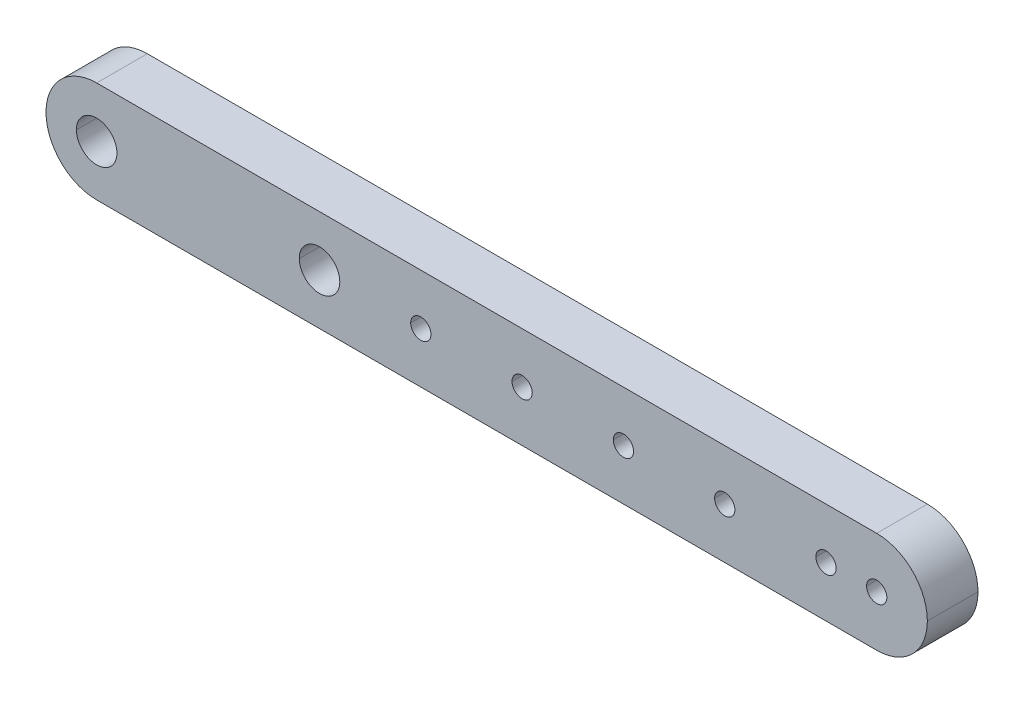
ISO-10303-21;
HEADER;
FILE_DESCRIPTION(('STEP AP214'),'2;1');
FILE_NAME('part.step','',(''),(''),'','','');
FILE_SCHEMA(('AUTOMOTIVE_DESIGN { 1 0 10303 214 1 1 1 1 }'));
ENDSEC;
DATA;
#1=APPLICATION_CONTEXT('core data for automotive mechanical design processes');
#2=APPLICATION_PROTOCOL_DEFINITION('international standard','automotive_design',2000,#1);
#3=PRODUCT_CONTEXT('',#1,'mechanical');
#4=PRODUCT('Part','Part','',(#3));
#5=PRODUCT_RELATED_PRODUCT_CATEGORY('part','',(#4));
#6=PRODUCT_DEFINITION_FORMATION('','',#4);
#7=PRODUCT_DEFINITION_CONTEXT('part definition',#1,'design');
#8=PRODUCT_DEFINITION('design','',#6,#7);
#9=PRODUCT_DEFINITION_SHAPE('','',#8);
#10=(LENGTH_UNIT() NAMED_UNIT(*) SI_UNIT(.MILLI.,.METRE.));
#11=(NAMED_UNIT(*) PLANE_ANGLE_UNIT() SI_UNIT($,.RADIAN.));
#12=(NAMED_UNIT(*) SI_UNIT($,.STERADIAN.) SOLID_ANGLE_UNIT());
#13=UNCERTAINTY_MEASURE_WITH_UNIT(LENGTH_MEASURE(1.E-05),#10,'distance_accuracy_value','');
#14=(GEOMETRIC_REPRESENTATION_CONTEXT(3) GLOBAL_UNCERTAINTY_ASSIGNED_CONTEXT((#13)) GLOBAL_UNIT_ASSIGNED_CONTEXT((#10,
#11,#12)) REPRESENTATION_CONTEXT('',''));
#15=CARTESIAN_POINT('',(0.,0.,0.));
#16=DIRECTION('',(0.,0.,1.));
#17=DIRECTION('',(1.,0.,0.));
#18=AXIS2_PLACEMENT_3D('',#15,#16,#17);
#19=CARTESIAN_POINT('',(164.,10.,10.));
#20=DIRECTION('',(0.,0.,-1.));
#21=DIRECTION('',(-1.,0.,0.));
#22=AXIS2_PLACEMENT_3D('',#19,#20,#21);
#23=CYLINDRICAL_SURFACE('',#22,10.);
#24=CARTESIAN_POINT('',(164.,10.,10.));
#25=DIRECTION('',(0.,0.,1.));
#26=DIRECTION('',(-1.,0.,0.));
#27=AXIS2_PLACEMENT_3D('',#24,#25,#26);
#28=CIRCLE('',#27,10.);
#29=CARTESIAN_POINT('',(164.,0.,10.));
#30=VERTEX_POINT('',#29);
#31=CARTESIAN_POINT('',(174.,10.,10.));
#32=VERTEX_POINT('',#31);
#33=EDGE_CURVE('E254',#30,#32,#28,.T.);
#34=ORIENTED_EDGE('',*,*,#33,.F.);
#35=DIRECTION('',(0.,0.,1.));
#36=VECTOR('',#35,1.);
#37=CARTESIAN_POINT('',(164.,0.,10.));
#38=LINE('',#37,#36);
#39=CARTESIAN_POINT('',(164.,0.,0.));
#40=VERTEX_POINT('',#39);
#41=EDGE_CURVE('E189',#40,#30,#38,.T.);
#42=ORIENTED_EDGE('',*,*,#41,.F.);
#43=CARTESIAN_POINT('',(164.,10.,0.));
#44=DIRECTION('',(0.,0.,-1.));
#45=DIRECTION('',(-1.,0.,0.));
#46=AXIS2_PLACEMENT_3D('',#43,#44,#45);
#47=CIRCLE('',#46,10.);
#48=CARTESIAN_POINT('',(174.,10.,0.));
#49=VERTEX_POINT('',#48);
#50=EDGE_CURVE('E276',#49,#40,#47,.T.);
#51=ORIENTED_EDGE('',*,*,#50,.F.);
#52=DIRECTION('',(0.,0.,1.));
#53=VECTOR('',#52,1.);
#54=CARTESIAN_POINT('',(174.,10.,10.));
#55=LINE('',#54,#53);
#56=EDGE_CURVE('E11',#49,#32,#55,.T.);
#57=ORIENTED_EDGE('',*,*,#56,.T.);
#58=EDGE_LOOP('',(#34,#42,#51,#57));
#59=FACE_BOUND('',#58,.T.);
#60=ADVANCED_FACE('F17',(#59),#23,.T.);
#61=CARTESIAN_POINT('',(164.,10.,10.));
#62=DIRECTION('',(0.,0.,-1.));
#63=DIRECTION('',(-1.,0.,0.));
#64=AXIS2_PLACEMENT_3D('',#61,#62,#63);
#65=CYLINDRICAL_SURFACE('',#64,10.);
#66=DIRECTION('',(0.,0.,-1.));
#67=VECTOR('',#66,1.);
#68=CARTESIAN_POINT('',(164.,20.,10.));
#69=LINE('',#68,#67);
#70=CARTESIAN_POINT('',(164.,20.,10.));
#71=VERTEX_POINT('',#70);
#72=CARTESIAN_POINT('',(164.,20.,0.));
#73=VERTEX_POINT('',#72);
#74=EDGE_CURVE('E188',#71,#73,#69,.T.);
#75=ORIENTED_EDGE('',*,*,#74,.F.);
#76=CARTESIAN_POINT('',(164.,10.,10.));
#77=DIRECTION('',(0.,0.,1.));
#78=DIRECTION('',(-1.,0.,0.));
#79=AXIS2_PLACEMENT_3D('',#76,#77,#78);
#80=CIRCLE('',#79,10.);
#81=EDGE_CURVE('E258',#32,#71,#80,.T.);
#82=ORIENTED_EDGE('',*,*,#81,.F.);
#83=ORIENTED_EDGE('',*,*,#56,.F.);
#84=CARTESIAN_POINT('',(164.,10.,0.));
#85=DIRECTION('',(0.,0.,-1.));
#86=DIRECTION('',(-1.,0.,0.));
#87=AXIS2_PLACEMENT_3D('',#84,#85,#86);
#88=CIRCLE('',#87,10.);
#89=EDGE_CURVE('E196',#73,#49,#88,.T.);
#90=ORIENTED_EDGE('',*,*,#89,.F.);
#91=EDGE_LOOP('',(#75,#82,#83,#90));
#92=FACE_BOUND('',#91,.T.);
#93=ADVANCED_FACE('F19',(#92),#65,.T.);
#94=CARTESIAN_POINT('',(10.,10.,10.));
#95=DIRECTION('',(0.,0.,-1.));
#96=DIRECTION('',(-1.,0.,0.));
#97=AXIS2_PLACEMENT_3D('',#94,#95,#96);
#98=CYLINDRICAL_SURFACE('',#97,10.);
#99=CARTESIAN_POINT('',(10.,10.,10.));
#100=DIRECTION('',(0.,0.,1.));
#101=DIRECTION('',(-1.,0.,0.));
#102=AXIS2_PLACEMENT_3D('',#99,#100,#101);
#103=CIRCLE('',#102,10.);
#104=CARTESIAN_POINT('',(0.,10.,10.));
#105=VERTEX_POINT('',#104);
#106=CARTESIAN_POINT('',(10.,0.,10.));
#107=VERTEX_POINT('',#106);
#108=EDGE_CURVE('E262',#105,#107,#103,.T.);
#109=ORIENTED_EDGE('',*,*,#108,.F.);
#110=DIRECTION('',(0.,0.,-1.));
#111=VECTOR('',#110,1.);
#112=CARTESIAN_POINT('',(0.,10.,10.));
#113=LINE('',#112,#111);
#114=CARTESIAN_POINT('',(0.,10.,0.));
#115=VERTEX_POINT('',#114);
#116=EDGE_CURVE('E27',#105,#115,#113,.T.);
#117=ORIENTED_EDGE('',*,*,#116,.T.);
#118=CARTESIAN_POINT('',(10.,10.,0.));
#119=DIRECTION('',(0.,0.,-1.));
#120=DIRECTION('',(-1.,0.,0.));
#121=AXIS2_PLACEMENT_3D('',#118,#119,#120);
#122=CIRCLE('',#121,10.);
#123=CARTESIAN_POINT('',(10.,0.,0.));
#124=VERTEX_POINT('',#123);
#125=EDGE_CURVE('E201',#124,#115,#122,.T.);
#126=ORIENTED_EDGE('',*,*,#125,.F.);
#127=DIRECTION('',(0.,0.,-1.));
#128=VECTOR('',#127,1.);
#129=CARTESIAN_POINT('',(10.,0.,10.));
#130=LINE('',#129,#128);
#131=EDGE_CURVE('E237',#107,#124,#130,.T.);
#132=ORIENTED_EDGE('',*,*,#131,.F.);
#133=EDGE_LOOP('',(#109,#117,#126,#132));
#134=FACE_BOUND('',#133,.T.);
#135=ADVANCED_FACE('F690',(#134),#98,.T.);
#136=CARTESIAN_POINT('',(10.,10.,10.));
#137=DIRECTION('',(0.,0.,-1.));
#138=DIRECTION('',(-1.,0.,0.));
#139=AXIS2_PLACEMENT_3D('',#136,#137,#138);
#140=CYLINDRICAL_SURFACE('',#139,10.);
#141=ORIENTED_EDGE('',*,*,#116,.F.);
#142=CARTESIAN_POINT('',(10.,10.,10.));
#143=DIRECTION('',(0.,0.,1.));
#144=DIRECTION('',(-1.,0.,0.));
#145=AXIS2_PLACEMENT_3D('',#142,#143,#144);
#146=CIRCLE('',#145,10.);
#147=CARTESIAN_POINT('',(10.,20.,10.));
#148=VERTEX_POINT('',#147);
#149=EDGE_CURVE('E183',#148,#105,#146,.T.);
#150=ORIENTED_EDGE('',*,*,#149,.F.);
#151=DIRECTION('',(0.,0.,1.));
#152=VECTOR('',#151,1.);
#153=CARTESIAN_POINT('',(10.,20.,10.));
#154=LINE('',#153,#152);
#155=CARTESIAN_POINT('',(10.,20.,0.));
#156=VERTEX_POINT('',#155);
#157=EDGE_CURVE('E176',#156,#148,#154,.T.);
#158=ORIENTED_EDGE('',*,*,#157,.F.);
#159=CARTESIAN_POINT('',(10.,10.,0.));
#160=DIRECTION('',(0.,0.,-1.));
#161=DIRECTION('',(-1.,0.,0.));
#162=AXIS2_PLACEMENT_3D('',#159,#160,#161);
#163=CIRCLE('',#162,10.);
#164=EDGE_CURVE('E180',#115,#156,#163,.T.);
#165=ORIENTED_EDGE('',*,*,#164,.F.);
#166=EDGE_LOOP('',(#141,#150,#158,#165));
#167=FACE_BOUND('',#166,.T.);
#168=ADVANCED_FACE('F178',(#167),#140,.T.);
#169=CARTESIAN_POINT('',(134.,10.,10.));
#170=DIRECTION('',(0.,0.,-1.));
#171=DIRECTION('',(-1.,0.,0.));
#172=AXIS2_PLACEMENT_3D('',#169,#170,#171);
#173=CYLINDRICAL_SURFACE('',#172,2.);
#174=DIRECTION('',(0.,0.,-1.));
#175=VECTOR('',#174,1.);
#176=CARTESIAN_POINT('',(136.,10.,10.));
#177=LINE('',#176,#175);
#178=CARTESIAN_POINT('',(136.,10.,10.));
#179=VERTEX_POINT('',#178);
#180=CARTESIAN_POINT('',(136.,10.,0.));
#181=VERTEX_POINT('',#180);
#182=EDGE_CURVE('E622',#179,#181,#177,.T.);
#183=ORIENTED_EDGE('',*,*,#182,.F.);
#184=CARTESIAN_POINT('',(134.,10.,10.));
#185=DIRECTION('',(0.,0.,1.));
#186=DIRECTION('',(1.,0.,0.));
#187=AXIS2_PLACEMENT_3D('',#184,#185,#186);
#188=CIRCLE('',#187,2.);
#189=CARTESIAN_POINT('',(132.,10.,10.));
#190=VERTEX_POINT('',#189);
#191=EDGE_CURVE('E300',#179,#190,#188,.T.);
#192=ORIENTED_EDGE('',*,*,#191,.T.);
#193=DIRECTION('',(0.,0.,-1.));
#194=VECTOR('',#193,1.);
#195=CARTESIAN_POINT('',(132.,10.,10.));
#196=LINE('',#195,#194);
#197=CARTESIAN_POINT('',(132.,10.,0.));
#198=VERTEX_POINT('',#197);
#199=EDGE_CURVE('E607',#190,#198,#196,.T.);
#200=ORIENTED_EDGE('',*,*,#199,.T.);
#201=CARTESIAN_POINT('',(134.,10.,0.));
#202=DIRECTION('',(0.,0.,1.));
#203=DIRECTION('',(1.,0.,0.));
#204=AXIS2_PLACEMENT_3D('',#201,#202,#203);
#205=CIRCLE('',#204,2.);
#206=EDGE_CURVE('E233',#181,#198,#205,.T.);
#207=ORIENTED_EDGE('',*,*,#206,.F.);
#208=EDGE_LOOP('',(#183,#192,#200,#207));
#209=FACE_BOUND('',#208,.T.);
#210=ADVANCED_FACE('F754',(#209),#173,.F.);
#211=CARTESIAN_POINT('',(94.,10.,10.));
#212=DIRECTION('',(0.,0.,-1.));
#213=DIRECTION('',(-1.,0.,0.));
#214=AXIS2_PLACEMENT_3D('',#211,#212,#213);
#215=CYLINDRICAL_SURFACE('',#214,2.);
#216=DIRECTION('',(0.,0.,-1.));
#217=VECTOR('',#216,1.);
#218=CARTESIAN_POINT('',(96.,10.,10.));
#219=LINE('',#218,#217);
#220=CARTESIAN_POINT('',(96.,10.,10.));
#221=VERTEX_POINT('',#220);
#222=CARTESIAN_POINT('',(96.,10.,0.));
#223=VERTEX_POINT('',#222);
#224=EDGE_CURVE('E592',#221,#223,#219,.T.);
#225=ORIENTED_EDGE('',*,*,#224,.F.);
#226=CARTESIAN_POINT('',(94.,10.,10.));
#227=DIRECTION('',(0.,0.,1.));
#228=DIRECTION('',(1.,0.,0.));
#229=AXIS2_PLACEMENT_3D('',#226,#227,#228);
#230=CIRCLE('',#229,2.);
#231=CARTESIAN_POINT('',(92.,10.,10.));
#232=VERTEX_POINT('',#231);
#233=EDGE_CURVE('E299',#221,#232,#230,.T.);
#234=ORIENTED_EDGE('',*,*,#233,.T.);
#235=DIRECTION('',(0.,0.,-1.));
#236=VECTOR('',#235,1.);
#237=CARTESIAN_POINT('',(92.,10.,10.));
#238=LINE('',#237,#236);
#239=CARTESIAN_POINT('',(92.,10.,0.));
#240=VERTEX_POINT('',#239);
#241=EDGE_CURVE('E578',#232,#240,#238,.T.);
#242=ORIENTED_EDGE('',*,*,#241,.T.);
#243=CARTESIAN_POINT('',(94.,10.,0.));
#244=DIRECTION('',(0.,0.,1.));
#245=DIRECTION('',(1.,0.,0.));
#246=AXIS2_PLACEMENT_3D('',#243,#244,#245);
#247=CIRCLE('',#246,2.);
#248=EDGE_CURVE('E220',#223,#240,#247,.T.);
#249=ORIENTED_EDGE('',*,*,#248,.F.);
#250=EDGE_LOOP('',(#225,#234,#242,#249));
#251=FACE_BOUND('',#250,.T.);
#252=ADVANCED_FACE('F750',(#251),#215,.F.);
#253=CARTESIAN_POINT('',(114.,10.,10.));
#254=DIRECTION('',(0.,0.,-1.));
#255=DIRECTION('',(-1.,0.,0.));
#256=AXIS2_PLACEMENT_3D('',#253,#254,#255);
#257=CYLINDRICAL_SURFACE('',#256,2.);
#258=DIRECTION('',(0.,0.,-1.));
#259=VECTOR('',#258,1.);
#260=CARTESIAN_POINT('',(116.,10.,10.));
#261=LINE('',#260,#259);
#262=CARTESIAN_POINT('',(116.,10.,10.));
#263=VERTEX_POINT('',#262);
#264=CARTESIAN_POINT('',(116.,10.,0.));
#265=VERTEX_POINT('',#264);
#266=EDGE_CURVE('E561',#263,#265,#261,.T.);
#267=ORIENTED_EDGE('',*,*,#266,.F.);
#268=CARTESIAN_POINT('',(114.,10.,10.));
#269=DIRECTION('',(0.,0.,1.));
#270=DIRECTION('',(1.,0.,0.));
#271=AXIS2_PLACEMENT_3D('',#268,#269,#270);
#272=CIRCLE('',#271,2.);
#273=CARTESIAN_POINT('',(112.,10.,10.));
#274=VERTEX_POINT('',#273);
#275=EDGE_CURVE('E295',#263,#274,#272,.T.);
#276=ORIENTED_EDGE('',*,*,#275,.T.);
#277=DIRECTION('',(0.,0.,-1.));
#278=VECTOR('',#277,1.);
#279=CARTESIAN_POINT('',(112.,10.,10.));
#280=LINE('',#279,#278);
#281=CARTESIAN_POINT('',(112.,10.,0.));
#282=VERTEX_POINT('',#281);
#283=EDGE_CURVE('E543',#274,#282,#280,.T.);
#284=ORIENTED_EDGE('',*,*,#283,.T.);
#285=CARTESIAN_POINT('',(114.,10.,0.));
#286=DIRECTION('',(0.,0.,1.));
#287=DIRECTION('',(1.,0.,0.));
#288=AXIS2_PLACEMENT_3D('',#285,#286,#287);
#289=CIRCLE('',#288,2.);
#290=EDGE_CURVE('E229',#265,#282,#289,.T.);
#291=ORIENTED_EDGE('',*,*,#290,.F.);
#292=EDGE_LOOP('',(#267,#276,#284,#291));
#293=FACE_BOUND('',#292,.T.);
#294=ADVANCED_FACE('F753',(#293),#257,.F.);
#295=CARTESIAN_POINT('',(74.,10.,10.));
#296=DIRECTION('',(0.,0.,-1.));
#297=DIRECTION('',(-1.,0.,0.));
#298=AXIS2_PLACEMENT_3D('',#295,#296,#297);
#299=CYLINDRICAL_SURFACE('',#298,2.);
#300=DIRECTION('',(0.,0.,-1.));
#301=VECTOR('',#300,1.);
#302=CARTESIAN_POINT('',(76.,10.,10.));
#303=LINE('',#302,#301);
#304=CARTESIAN_POINT('',(76.,10.,10.));
#305=VERTEX_POINT('',#304);
#306=CARTESIAN_POINT('',(76.,10.,0.));
#307=VERTEX_POINT('',#306);
#308=EDGE_CURVE('E526',#305,#307,#303,.T.);
#309=ORIENTED_EDGE('',*,*,#308,.F.);
#310=CARTESIAN_POINT('',(74.,10.,10.));
#311=DIRECTION('',(0.,0.,1.));
#312=DIRECTION('',(1.,0.,0.));
#313=AXIS2_PLACEMENT_3D('',#310,#311,#312);
#314=CIRCLE('',#313,2.);
#315=CARTESIAN_POINT('',(72.,10.,10.));
#316=VERTEX_POINT('',#315);
#317=EDGE_CURVE('E292',#305,#316,#314,.T.);
#318=ORIENTED_EDGE('',*,*,#317,.T.);
#319=DIRECTION('',(0.,0.,-1.));
#320=VECTOR('',#319,1.);
#321=CARTESIAN_POINT('',(72.,10.,10.));
#322=LINE('',#321,#320);
#323=CARTESIAN_POINT('',(72.,10.,0.));
#324=VERTEX_POINT('',#323);
#325=EDGE_CURVE('E508',#316,#324,#322,.T.);
#326=ORIENTED_EDGE('',*,*,#325,.T.);
#327=CARTESIAN_POINT('',(74.,10.,0.));
#328=DIRECTION('',(0.,0.,1.));
#329=DIRECTION('',(1.,0.,0.));
#330=AXIS2_PLACEMENT_3D('',#327,#328,#329);
#331=CIRCLE('',#330,2.);
#332=EDGE_CURVE('E217',#307,#324,#331,.T.);
#333=ORIENTED_EDGE('',*,*,#332,.F.);
#334=EDGE_LOOP('',(#309,#318,#326,#333));
#335=FACE_BOUND('',#334,.T.);
#336=ADVANCED_FACE('F706',(#335),#299,.F.);
#337=CARTESIAN_POINT('',(164.,10.,10.));
#338=DIRECTION('',(0.,0.,-1.));
#339=DIRECTION('',(-1.,0.,0.));
#340=AXIS2_PLACEMENT_3D('',#337,#338,#339);
#341=CYLINDRICAL_SURFACE('',#340,1.99999999999997);
#342=DIRECTION('',(0.,0.,-1.));
#343=VECTOR('',#342,1.);
#344=CARTESIAN_POINT('',(166.,10.,10.));
#345=LINE('',#344,#343);
#346=CARTESIAN_POINT('',(166.,10.,10.));
#347=VERTEX_POINT('',#346);
#348=CARTESIAN_POINT('',(166.,10.,0.));
#349=VERTEX_POINT('',#348);
#350=EDGE_CURVE('E491',#347,#349,#345,.T.);
#351=ORIENTED_EDGE('',*,*,#350,.F.);
#352=CARTESIAN_POINT('',(164.,10.,10.));
#353=DIRECTION('',(0.,0.,1.));
#354=DIRECTION('',(1.,0.,0.));
#355=AXIS2_PLACEMENT_3D('',#352,#353,#354);
#356=CIRCLE('',#355,1.99999999999997);
#357=CARTESIAN_POINT('',(162.,10.,10.));
#358=VERTEX_POINT('',#357);
#359=EDGE_CURVE('E289',#347,#358,#356,.T.);
#360=ORIENTED_EDGE('',*,*,#359,.T.);
#361=DIRECTION('',(0.,0.,-1.));
#362=VECTOR('',#361,1.);
#363=CARTESIAN_POINT('',(162.,10.,10.));
#364=LINE('',#363,#362);
#365=CARTESIAN_POINT('',(162.,10.,0.));
#366=VERTEX_POINT('',#365);
#367=EDGE_CURVE('E473',#358,#366,#364,.T.);
#368=ORIENTED_EDGE('',*,*,#367,.T.);
#369=CARTESIAN_POINT('',(164.,10.,0.));
#370=DIRECTION('',(0.,0.,1.));
#371=DIRECTION('',(1.,0.,0.));
#372=AXIS2_PLACEMENT_3D('',#369,#370,#371);
#373=CIRCLE('',#372,1.99999999999997);
#374=EDGE_CURVE('E225',#349,#366,#373,.T.);
#375=ORIENTED_EDGE('',*,*,#374,.F.);
#376=EDGE_LOOP('',(#351,#360,#368,#375));
#377=FACE_BOUND('',#376,.T.);
#378=ADVANCED_FACE('F702',(#377),#341,.F.);
#379=CARTESIAN_POINT('',(154.,10.,10.));
#380=DIRECTION('',(0.,0.,-1.));
#381=DIRECTION('',(-1.,0.,0.));
#382=AXIS2_PLACEMENT_3D('',#379,#380,#381);
#383=CYLINDRICAL_SURFACE('',#382,2.);
#384=DIRECTION('',(0.,0.,-1.));
#385=VECTOR('',#384,1.);
#386=CARTESIAN_POINT('',(156.,10.,10.));
#387=LINE('',#386,#385);
#388=CARTESIAN_POINT('',(156.,10.,10.));
#389=VERTEX_POINT('',#388);
#390=CARTESIAN_POINT('',(156.,10.,0.));
#391=VERTEX_POINT('',#390);
#392=EDGE_CURVE('E457',#389,#391,#387,.T.);
#393=ORIENTED_EDGE('',*,*,#392,.F.);
#394=CARTESIAN_POINT('',(154.,10.,10.));
#395=DIRECTION('',(0.,0.,1.));
#396=DIRECTION('',(1.,0.,0.));
#397=AXIS2_PLACEMENT_3D('',#394,#395,#396);
#398=CIRCLE('',#397,2.);
#399=CARTESIAN_POINT('',(152.,10.,10.));
#400=VERTEX_POINT('',#399);
#401=EDGE_CURVE('E283',#389,#400,#398,.T.);
#402=ORIENTED_EDGE('',*,*,#401,.T.);
#403=DIRECTION('',(0.,0.,-1.));
#404=VECTOR('',#403,1.);
#405=CARTESIAN_POINT('',(152.,10.,10.));
#406=LINE('',#405,#404);
#407=CARTESIAN_POINT('',(152.,10.,0.));
#408=VERTEX_POINT('',#407);
#409=EDGE_CURVE('E433',#400,#408,#406,.T.);
#410=ORIENTED_EDGE('',*,*,#409,.T.);
#411=CARTESIAN_POINT('',(154.,10.,0.));
#412=DIRECTION('',(0.,0.,1.));
#413=DIRECTION('',(1.,0.,0.));
#414=AXIS2_PLACEMENT_3D('',#411,#412,#413);
#415=CIRCLE('',#414,2.);
#416=EDGE_CURVE('E216',#391,#408,#415,.T.);
#417=ORIENTED_EDGE('',*,*,#416,.F.);
#418=EDGE_LOOP('',(#393,#402,#410,#417));
#419=FACE_BOUND('',#418,.T.);
#420=ADVANCED_FACE('F705',(#419),#383,.F.);
#421=CARTESIAN_POINT('',(10.,10.,10.));
#422=DIRECTION('',(0.,0.,-1.));
#423=DIRECTION('',(-1.,0.,0.));
#424=AXIS2_PLACEMENT_3D('',#421,#422,#423);
#425=CYLINDRICAL_SURFACE('',#424,4.);
#426=DIRECTION('',(0.,0.,-1.));
#427=VECTOR('',#426,1.);
#428=CARTESIAN_POINT('',(14.,10.,10.));
#429=LINE('',#428,#427);
#430=CARTESIAN_POINT('',(14.,10.,10.));
#431=VERTEX_POINT('',#430);
#432=CARTESIAN_POINT('',(14.,10.,0.));
#433=VERTEX_POINT('',#432);
#434=EDGE_CURVE('E422',#431,#433,#429,.T.);
#435=ORIENTED_EDGE('',*,*,#434,.F.);
#436=CARTESIAN_POINT('',(10.,10.,10.));
#437=DIRECTION('',(0.,0.,1.));
#438=DIRECTION('',(1.,0.,0.));
#439=AXIS2_PLACEMENT_3D('',#436,#437,#438);
#440=CIRCLE('',#439,4.);
#441=CARTESIAN_POINT('',(6.,10.,10.));
#442=VERTEX_POINT('',#441);
#443=EDGE_CURVE('E280',#431,#442,#440,.T.);
#444=ORIENTED_EDGE('',*,*,#443,.T.);
#445=DIRECTION('',(0.,0.,-1.));
#446=VECTOR('',#445,1.);
#447=CARTESIAN_POINT('',(6.,10.,10.));
#448=LINE('',#447,#446);
#449=CARTESIAN_POINT('',(6.,10.,0.));
#450=VERTEX_POINT('',#449);
#451=EDGE_CURVE('E394',#442,#450,#448,.T.);
#452=ORIENTED_EDGE('',*,*,#451,.T.);
#453=CARTESIAN_POINT('',(10.,10.,0.));
#454=DIRECTION('',(0.,0.,1.));
#455=DIRECTION('',(1.,0.,0.));
#456=AXIS2_PLACEMENT_3D('',#453,#454,#455);
#457=CIRCLE('',#456,4.);
#458=EDGE_CURVE('E215',#433,#450,#457,.T.);
#459=ORIENTED_EDGE('',*,*,#458,.F.);
#460=EDGE_LOOP('',(#435,#444,#452,#459));
#461=FACE_BOUND('',#460,.T.);
#462=ADVANCED_FACE('F716',(#461),#425,.F.);
#463=CARTESIAN_POINT('',(54.,10.,10.));
#464=DIRECTION('',(0.,0.,-1.));
#465=DIRECTION('',(-1.,0.,0.));
#466=AXIS2_PLACEMENT_3D('',#463,#464,#465);
#467=CYLINDRICAL_SURFACE('',#466,4.);
#468=DIRECTION('',(0.,0.,-1.));
#469=VECTOR('',#468,1.);
#470=CARTESIAN_POINT('',(58.,10.,10.));
#471=LINE('',#470,#469);
#472=CARTESIAN_POINT('',(58.,10.,10.));
#473=VERTEX_POINT('',#472);
#474=CARTESIAN_POINT('',(58.,10.,0.));
#475=VERTEX_POINT('',#474);
#476=EDGE_CURVE('E393',#473,#475,#471,.T.);
#477=ORIENTED_EDGE('',*,*,#476,.F.);
#478=CARTESIAN_POINT('',(54.,10.,10.));
#479=DIRECTION('',(0.,0.,1.));
#480=DIRECTION('',(1.,0.,0.));
#481=AXIS2_PLACEMENT_3D('',#478,#479,#480);
#482=CIRCLE('',#481,4.);
#483=CARTESIAN_POINT('',(50.,10.,10.));
#484=VERTEX_POINT('',#483);
#485=EDGE_CURVE('E277',#473,#484,#482,.T.);
#486=ORIENTED_EDGE('',*,*,#485,.T.);
#487=DIRECTION('',(0.,0.,-1.));
#488=VECTOR('',#487,1.);
#489=CARTESIAN_POINT('',(50.,10.,10.));
#490=LINE('',#489,#488);
#491=CARTESIAN_POINT('',(50.,10.,0.));
#492=VERTEX_POINT('',#491);
#493=EDGE_CURVE('E383',#484,#492,#490,.T.);
#494=ORIENTED_EDGE('',*,*,#493,.T.);
#495=CARTESIAN_POINT('',(54.,10.,0.));
#496=DIRECTION('',(0.,0.,1.));
#497=DIRECTION('',(1.,0.,0.));
#498=AXIS2_PLACEMENT_3D('',#495,#496,#497);
#499=CIRCLE('',#498,4.);
#500=EDGE_CURVE('E212',#475,#492,#499,.T.);
#501=ORIENTED_EDGE('',*,*,#500,.F.);
#502=EDGE_LOOP('',(#477,#486,#494,#501));
#503=FACE_BOUND('',#502,.T.);
#504=ADVANCED_FACE('F713',(#503),#467,.F.);
#505=CARTESIAN_POINT('',(60.,20.,10.));
#506=DIRECTION('',(0.,-1.,0.));
#507=DIRECTION('',(0.,0.,-1.));
#508=AXIS2_PLACEMENT_3D('',#505,#506,#507);
#509=PLANE('',#508);
#510=DIRECTION('',(-1.,0.,0.));
#511=VECTOR('',#510,1.);
#512=CARTESIAN_POINT('',(60.,20.,0.));
#513=LINE('',#512,#511);
#514=EDGE_CURVE('E191',#73,#156,#513,.T.);
#515=ORIENTED_EDGE('',*,*,#514,.T.);
#516=ORIENTED_EDGE('',*,*,#157,.T.);
#517=DIRECTION('',(-1.,0.,0.));
#518=VECTOR('',#517,1.);
#519=CARTESIAN_POINT('',(0.,20.,10.));
#520=LINE('',#519,#518);
#521=EDGE_CURVE('E273',#71,#148,#520,.T.);
#522=ORIENTED_EDGE('',*,*,#521,.F.);
#523=ORIENTED_EDGE('',*,*,#74,.T.);
#524=EDGE_LOOP('',(#515,#516,#522,#523));
#525=FACE_BOUND('',#524,.T.);
#526=ADVANCED_FACE('F192',(#525),#509,.F.);
#527=CARTESIAN_POINT('',(174.,0.,10.));
#528=DIRECTION('',(0.,1.,0.));
#529=DIRECTION('',(1.,0.,0.));
#530=AXIS2_PLACEMENT_3D('',#527,#528,#529);
#531=PLANE('',#530);
#532=DIRECTION('',(1.,0.,0.));
#533=VECTOR('',#532,1.);
#534=CARTESIAN_POINT('',(0.,0.,10.));
#535=LINE('',#534,#533);
#536=EDGE_CURVE('E249',#107,#30,#535,.T.);
#537=ORIENTED_EDGE('',*,*,#536,.F.);
#538=ORIENTED_EDGE('',*,*,#131,.T.);
#539=DIRECTION('',(1.,0.,0.));
#540=VECTOR('',#539,1.);
#541=CARTESIAN_POINT('',(174.,0.,0.));
#542=LINE('',#541,#540);
#543=EDGE_CURVE('E208',#124,#40,#542,.T.);
#544=ORIENTED_EDGE('',*,*,#543,.T.);
#545=ORIENTED_EDGE('',*,*,#41,.T.);
#546=EDGE_LOOP('',(#537,#538,#544,#545));
#547=FACE_BOUND('',#546,.T.);
#548=ADVANCED_FACE('F247',(#547),#531,.F.);
#549=CARTESIAN_POINT('',(0.,0.,0.));
#550=DIRECTION('',(0.,0.,-1.));
#551=DIRECTION('',(0.,-1.,0.));
#552=AXIS2_PLACEMENT_3D('',#549,#550,#551);
#553=PLANE('',#552);
#554=CARTESIAN_POINT('',(134.,10.,0.));
#555=DIRECTION('',(0.,0.,1.));
#556=DIRECTION('',(1.,0.,0.));
#557=AXIS2_PLACEMENT_3D('',#554,#555,#556);
#558=CIRCLE('',#557,2.);
#559=EDGE_CURVE('E615',#198,#181,#558,.T.);
#560=ORIENTED_EDGE('',*,*,#559,.T.);
#561=ORIENTED_EDGE('',*,*,#206,.T.);
#562=EDGE_LOOP('',(#560,#561));
#563=FACE_BOUND('',#562,.T.);
#564=CARTESIAN_POINT('',(114.,10.,0.));
#565=DIRECTION('',(0.,0.,1.));
#566=DIRECTION('',(1.,0.,0.));
#567=AXIS2_PLACEMENT_3D('',#564,#565,#566);
#568=CIRCLE('',#567,2.);
#569=EDGE_CURVE('E553',#282,#265,#568,.T.);
#570=ORIENTED_EDGE('',*,*,#569,.T.);
#571=ORIENTED_EDGE('',*,*,#290,.T.);
#572=EDGE_LOOP('',(#570,#571));
#573=FACE_BOUND('',#572,.T.);
#574=CARTESIAN_POINT('',(164.,10.,0.));
#575=DIRECTION('',(0.,0.,1.));
#576=DIRECTION('',(1.,0.,0.));
#577=AXIS2_PLACEMENT_3D('',#574,#575,#576);
#578=CIRCLE('',#577,1.99999999999997);
#579=EDGE_CURVE('E482',#366,#349,#578,.T.);
#580=ORIENTED_EDGE('',*,*,#579,.T.);
#581=ORIENTED_EDGE('',*,*,#374,.T.);
#582=EDGE_LOOP('',(#580,#581));
#583=FACE_BOUND('',#582,.T.);
#584=CARTESIAN_POINT('',(10.,10.,0.));
#585=DIRECTION('',(0.,0.,1.));
#586=DIRECTION('',(1.,0.,0.));
#587=AXIS2_PLACEMENT_3D('',#584,#585,#586);
#588=CIRCLE('',#587,4.);
#589=EDGE_CURVE('E404',#450,#433,#588,.T.);
#590=ORIENTED_EDGE('',*,*,#589,.T.);
#591=ORIENTED_EDGE('',*,*,#458,.T.);
#592=EDGE_LOOP('',(#590,#591));
#593=FACE_BOUND('',#592,.T.);
#594=CARTESIAN_POINT('',(54.,10.,0.));
#595=DIRECTION('',(0.,0.,1.));
#596=DIRECTION('',(1.,0.,0.));
#597=AXIS2_PLACEMENT_3D('',#594,#595,#596);
#598=CIRCLE('',#597,4.);
#599=EDGE_CURVE('E413',#492,#475,#598,.T.);
#600=ORIENTED_EDGE('',*,*,#599,.T.);
#601=ORIENTED_EDGE('',*,*,#500,.T.);
#602=EDGE_LOOP('',(#600,#601));
#603=FACE_BOUND('',#602,.T.);
#604=CARTESIAN_POINT('',(154.,10.,0.));
#605=DIRECTION('',(0.,0.,1.));
#606=DIRECTION('',(1.,0.,0.));
#607=AXIS2_PLACEMENT_3D('',#604,#605,#606);
#608=CIRCLE('',#607,2.);
#609=EDGE_CURVE('E449',#408,#391,#608,.T.);
#610=ORIENTED_EDGE('',*,*,#609,.T.);
#611=ORIENTED_EDGE('',*,*,#416,.T.);
#612=EDGE_LOOP('',(#610,#611));
#613=FACE_BOUND('',#612,.T.);
#614=CARTESIAN_POINT('',(74.,10.,0.));
#615=DIRECTION('',(0.,0.,1.));
#616=DIRECTION('',(1.,0.,0.));
#617=AXIS2_PLACEMENT_3D('',#614,#615,#616);
#618=CIRCLE('',#617,2.);
#619=EDGE_CURVE('E517',#324,#307,#618,.T.);
#620=ORIENTED_EDGE('',*,*,#619,.T.);
#621=ORIENTED_EDGE('',*,*,#332,.T.);
#622=EDGE_LOOP('',(#620,#621));
#623=FACE_BOUND('',#622,.T.);
#624=CARTESIAN_POINT('',(94.,10.,0.));
#625=DIRECTION('',(0.,0.,1.));
#626=DIRECTION('',(1.,0.,0.));
#627=AXIS2_PLACEMENT_3D('',#624,#625,#626);
#628=CIRCLE('',#627,2.);
#629=EDGE_CURVE('E585',#240,#223,#628,.T.);
#630=ORIENTED_EDGE('',*,*,#629,.T.);
#631=ORIENTED_EDGE('',*,*,#248,.T.);
#632=EDGE_LOOP('',(#630,#631));
#633=FACE_BOUND('',#632,.T.);
#634=ORIENTED_EDGE('',*,*,#543,.F.);
#635=ORIENTED_EDGE('',*,*,#125,.T.);
#636=ORIENTED_EDGE('',*,*,#164,.T.);
#637=ORIENTED_EDGE('',*,*,#514,.F.);
#638=ORIENTED_EDGE('',*,*,#89,.T.);
#639=ORIENTED_EDGE('',*,*,#50,.T.);
#640=EDGE_LOOP('',(#634,#635,#636,#637,#638,#639));
#641=FACE_BOUND('',#640,.T.);
#642=ADVANCED_FACE('F199',(#563,#573,#583,#593,#603,#613,#623,#633,#641),#553,.T.);
#643=CARTESIAN_POINT('',(0.,0.,10.));
#644=DIRECTION('',(0.,0.,-1.));
#645=DIRECTION('',(0.,-1.,0.));
#646=AXIS2_PLACEMENT_3D('',#643,#644,#645);
#647=PLANE('',#646);
#648=CARTESIAN_POINT('',(134.,10.,10.));
#649=DIRECTION('',(0.,0.,1.));
#650=DIRECTION('',(1.,0.,0.));
#651=AXIS2_PLACEMENT_3D('',#648,#649,#650);
#652=CIRCLE('',#651,2.);
#653=EDGE_CURVE('E629',#190,#179,#652,.T.);
#654=ORIENTED_EDGE('',*,*,#653,.F.);
#655=ORIENTED_EDGE('',*,*,#191,.F.);
#656=EDGE_LOOP('',(#654,#655));
#657=FACE_BOUND('',#656,.T.);
#658=CARTESIAN_POINT('',(94.,10.,10.));
#659=DIRECTION('',(0.,0.,1.));
#660=DIRECTION('',(1.,0.,0.));
#661=AXIS2_PLACEMENT_3D('',#658,#659,#660);
#662=CIRCLE('',#661,2.);
#663=EDGE_CURVE('E600',#232,#221,#662,.T.);
#664=ORIENTED_EDGE('',*,*,#663,.F.);
#665=ORIENTED_EDGE('',*,*,#233,.F.);
#666=EDGE_LOOP('',(#664,#665));
#667=FACE_BOUND('',#666,.T.);
#668=CARTESIAN_POINT('',(114.,10.,10.));
#669=DIRECTION('',(0.,0.,1.));
#670=DIRECTION('',(1.,0.,0.));
#671=AXIS2_PLACEMENT_3D('',#668,#669,#670);
#672=CIRCLE('',#671,2.);
#673=EDGE_CURVE('E570',#274,#263,#672,.T.);
#674=ORIENTED_EDGE('',*,*,#673,.F.);
#675=ORIENTED_EDGE('',*,*,#275,.F.);
#676=EDGE_LOOP('',(#674,#675));
#677=FACE_BOUND('',#676,.T.);
#678=CARTESIAN_POINT('',(74.,10.,10.));
#679=DIRECTION('',(0.,0.,1.));
#680=DIRECTION('',(1.,0.,0.));
#681=AXIS2_PLACEMENT_3D('',#678,#679,#680);
#682=CIRCLE('',#681,2.);
#683=EDGE_CURVE('E534',#316,#305,#682,.T.);
#684=ORIENTED_EDGE('',*,*,#683,.F.);
#685=ORIENTED_EDGE('',*,*,#317,.F.);
#686=EDGE_LOOP('',(#684,#685));
#687=FACE_BOUND('',#686,.T.);
#688=CARTESIAN_POINT('',(164.,10.,10.));
#689=DIRECTION('',(0.,0.,1.));
#690=DIRECTION('',(1.,0.,0.));
#691=AXIS2_PLACEMENT_3D('',#688,#689,#690);
#692=CIRCLE('',#691,1.99999999999997);
#693=EDGE_CURVE('E499',#358,#347,#692,.T.);
#694=ORIENTED_EDGE('',*,*,#693,.F.);
#695=ORIENTED_EDGE('',*,*,#359,.F.);
#696=EDGE_LOOP('',(#694,#695));
#697=FACE_BOUND('',#696,.T.);
#698=CARTESIAN_POINT('',(154.,10.,10.));
#699=DIRECTION('',(0.,0.,1.));
#700=DIRECTION('',(1.,0.,0.));
#701=AXIS2_PLACEMENT_3D('',#698,#699,#700);
#702=CIRCLE('',#701,2.);
#703=EDGE_CURVE('E465',#400,#389,#702,.T.);
#704=ORIENTED_EDGE('',*,*,#703,.F.);
#705=ORIENTED_EDGE('',*,*,#401,.F.);
#706=EDGE_LOOP('',(#704,#705));
#707=FACE_BOUND('',#706,.T.);
#708=CARTESIAN_POINT('',(10.,10.,10.));
#709=DIRECTION('',(0.,0.,1.));
#710=DIRECTION('',(1.,0.,0.));
#711=AXIS2_PLACEMENT_3D('',#708,#709,#710);
#712=CIRCLE('',#711,4.);
#713=EDGE_CURVE('E428',#442,#431,#712,.T.);
#714=ORIENTED_EDGE('',*,*,#713,.F.);
#715=ORIENTED_EDGE('',*,*,#443,.F.);
#716=EDGE_LOOP('',(#714,#715));
#717=FACE_BOUND('',#716,.T.);
#718=CARTESIAN_POINT('',(54.,10.,10.));
#719=DIRECTION('',(0.,0.,1.));
#720=DIRECTION('',(1.,0.,0.));
#721=AXIS2_PLACEMENT_3D('',#718,#719,#720);
#722=CIRCLE('',#721,4.);
#723=EDGE_CURVE('E388',#484,#473,#722,.T.);
#724=ORIENTED_EDGE('',*,*,#723,.F.);
#725=ORIENTED_EDGE('',*,*,#485,.F.);
#726=EDGE_LOOP('',(#724,#725));
#727=FACE_BOUND('',#726,.T.);
#728=ORIENTED_EDGE('',*,*,#149,.T.);
#729=ORIENTED_EDGE('',*,*,#108,.T.);
#730=ORIENTED_EDGE('',*,*,#536,.T.);
#731=ORIENTED_EDGE('',*,*,#33,.T.);
#732=ORIENTED_EDGE('',*,*,#81,.T.);
#733=ORIENTED_EDGE('',*,*,#521,.T.);
#734=EDGE_LOOP('',(#728,#729,#730,#731,#732,#733));
#735=FACE_BOUND('',#734,.T.);
#736=ADVANCED_FACE('F260',(#657,#667,#677,#687,#697,#707,#717,#727,#735),#647,.F.);
#737=CARTESIAN_POINT('',(54.,10.,10.));
#738=DIRECTION('',(0.,0.,-1.));
#739=DIRECTION('',(-1.,0.,0.));
#740=AXIS2_PLACEMENT_3D('',#737,#738,#739);
#741=CYLINDRICAL_SURFACE('',#740,4.);
#742=ORIENTED_EDGE('',*,*,#723,.T.);
#743=ORIENTED_EDGE('',*,*,#476,.T.);
#744=ORIENTED_EDGE('',*,*,#599,.F.);
#745=ORIENTED_EDGE('',*,*,#493,.F.);
#746=EDGE_LOOP('',(#742,#743,#744,#745));
#747=FACE_BOUND('',#746,.T.);
#748=ADVANCED_FACE('F738',(#747),#741,.F.);
#749=CARTESIAN_POINT('',(10.,10.,10.));
#750=DIRECTION('',(0.,0.,-1.));
#751=DIRECTION('',(-1.,0.,0.));
#752=AXIS2_PLACEMENT_3D('',#749,#750,#751);
#753=CYLINDRICAL_SURFACE('',#752,4.);
#754=ORIENTED_EDGE('',*,*,#713,.T.);
#755=ORIENTED_EDGE('',*,*,#434,.T.);
#756=ORIENTED_EDGE('',*,*,#589,.F.);
#757=ORIENTED_EDGE('',*,*,#451,.F.);
#758=EDGE_LOOP('',(#754,#755,#756,#757));
#759=FACE_BOUND('',#758,.T.);
#760=ADVANCED_FACE('F745',(#759),#753,.F.);
#761=CARTESIAN_POINT('',(154.,10.,10.));
#762=DIRECTION('',(0.,0.,-1.));
#763=DIRECTION('',(-1.,0.,0.));
#764=AXIS2_PLACEMENT_3D('',#761,#762,#763);
#765=CYLINDRICAL_SURFACE('',#764,2.);
#766=ORIENTED_EDGE('',*,*,#703,.T.);
#767=ORIENTED_EDGE('',*,*,#392,.T.);
#768=ORIENTED_EDGE('',*,*,#609,.F.);
#769=ORIENTED_EDGE('',*,*,#409,.F.);
#770=EDGE_LOOP('',(#766,#767,#768,#769));
#771=FACE_BOUND('',#770,.T.);
#772=ADVANCED_FACE('F724',(#771),#765,.F.);
#773=CARTESIAN_POINT('',(164.,10.,10.));
#774=DIRECTION('',(0.,0.,-1.));
#775=DIRECTION('',(-1.,0.,0.));
#776=AXIS2_PLACEMENT_3D('',#773,#774,#775);
#777=CYLINDRICAL_SURFACE('',#776,1.99999999999997);
#778=ORIENTED_EDGE('',*,*,#693,.T.);
#779=ORIENTED_EDGE('',*,*,#350,.T.);
#780=ORIENTED_EDGE('',*,*,#579,.F.);
#781=ORIENTED_EDGE('',*,*,#367,.F.);
#782=EDGE_LOOP('',(#778,#779,#780,#781));
#783=FACE_BOUND('',#782,.T.);
#784=ADVANCED_FACE('F720',(#783),#777,.F.);
#785=CARTESIAN_POINT('',(74.,10.,10.));
#786=DIRECTION('',(0.,0.,-1.));
#787=DIRECTION('',(-1.,0.,0.));
#788=AXIS2_PLACEMENT_3D('',#785,#786,#787);
#789=CYLINDRICAL_SURFACE('',#788,2.);
#790=ORIENTED_EDGE('',*,*,#683,.T.);
#791=ORIENTED_EDGE('',*,*,#308,.T.);
#792=ORIENTED_EDGE('',*,*,#619,.F.);
#793=ORIENTED_EDGE('',*,*,#325,.F.);
#794=EDGE_LOOP('',(#790,#791,#792,#793));
#795=FACE_BOUND('',#794,.T.);
#796=ADVANCED_FACE('F723',(#795),#789,.F.);
#797=CARTESIAN_POINT('',(114.,10.,10.));
#798=DIRECTION('',(0.,0.,-1.));
#799=DIRECTION('',(-1.,0.,0.));
#800=AXIS2_PLACEMENT_3D('',#797,#798,#799);
#801=CYLINDRICAL_SURFACE('',#800,2.);
#802=ORIENTED_EDGE('',*,*,#673,.T.);
#803=ORIENTED_EDGE('',*,*,#266,.T.);
#804=ORIENTED_EDGE('',*,*,#569,.F.);
#805=ORIENTED_EDGE('',*,*,#283,.F.);
#806=EDGE_LOOP('',(#802,#803,#804,#805));
#807=FACE_BOUND('',#806,.T.);
#808=ADVANCED_FACE('F728',(#807),#801,.F.);
#809=CARTESIAN_POINT('',(94.,10.,10.));
#810=DIRECTION('',(0.,0.,-1.));
#811=DIRECTION('',(-1.,0.,0.));
#812=AXIS2_PLACEMENT_3D('',#809,#810,#811);
#813=CYLINDRICAL_SURFACE('',#812,2.);
#814=ORIENTED_EDGE('',*,*,#663,.T.);
#815=ORIENTED_EDGE('',*,*,#224,.T.);
#816=ORIENTED_EDGE('',*,*,#629,.F.);
#817=ORIENTED_EDGE('',*,*,#241,.F.);
#818=EDGE_LOOP('',(#814,#815,#816,#817));
#819=FACE_BOUND('',#818,.T.);
#820=ADVANCED_FACE('F711',(#819),#813,.F.);
#821=CARTESIAN_POINT('',(134.,10.,10.));
#822=DIRECTION('',(0.,0.,-1.));
#823=DIRECTION('',(-1.,0.,0.));
#824=AXIS2_PLACEMENT_3D('',#821,#822,#823);
#825=CYLINDRICAL_SURFACE('',#824,2.);
#826=ORIENTED_EDGE('',*,*,#653,.T.);
#827=ORIENTED_EDGE('',*,*,#182,.T.);
#828=ORIENTED_EDGE('',*,*,#559,.F.);
#829=ORIENTED_EDGE('',*,*,#199,.F.);
#830=EDGE_LOOP('',(#826,#827,#828,#829));
#831=FACE_BOUND('',#830,.T.);
#832=ADVANCED_FACE('F708',(#831),#825,.F.);
#833=CLOSED_SHELL('',(#60,#93,#135,#168,#210,#252,#294,#336,#378,#420,#462,#504,#526,#548,#642,
#736,#748,#760,#772,#784,#796,#808,#820,#832));
#834=MANIFOLD_SOLID_BREP('B1',#833);
#835=ADVANCED_BREP_SHAPE_REPRESENTATION('',(#18,#834),#14);
#836=SHAPE_DEFINITION_REPRESENTATION(#9,#835);
ENDSEC;
END-ISO-10303-21;
